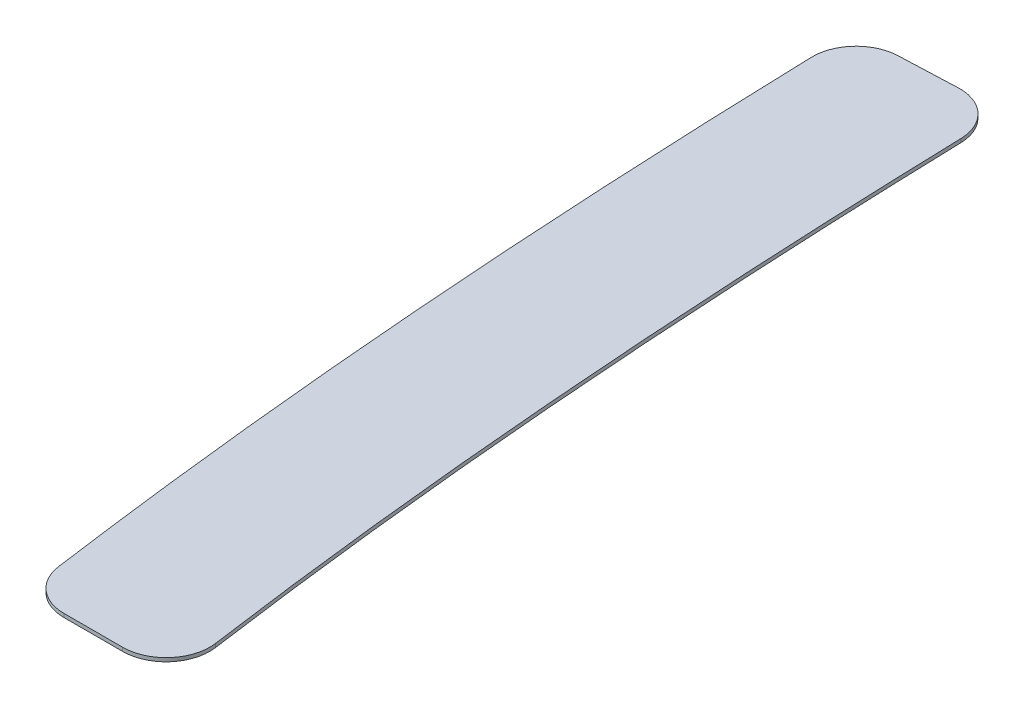
ISO-10303-21;
HEADER;
FILE_DESCRIPTION(('STEP AP214'),'2;1');
FILE_NAME('part.step','',(''),(''),'','','');
FILE_SCHEMA(('AUTOMOTIVE_DESIGN { 1 0 10303 214 1 1 1 1 }'));
ENDSEC;
DATA;
#1=APPLICATION_CONTEXT('core data for automotive mechanical design processes');
#2=APPLICATION_PROTOCOL_DEFINITION('international standard','automotive_design',2000,#1);
#3=PRODUCT_CONTEXT('',#1,'mechanical');
#4=PRODUCT('Part','Part','',(#3));
#5=PRODUCT_RELATED_PRODUCT_CATEGORY('part','',(#4));
#6=PRODUCT_DEFINITION_FORMATION('','',#4);
#7=PRODUCT_DEFINITION_CONTEXT('part definition',#1,'design');
#8=PRODUCT_DEFINITION('design','',#6,#7);
#9=PRODUCT_DEFINITION_SHAPE('','',#8);
#10=(LENGTH_UNIT() NAMED_UNIT(*) SI_UNIT(.MILLI.,.METRE.));
#11=(NAMED_UNIT(*) PLANE_ANGLE_UNIT() SI_UNIT($,.RADIAN.));
#12=(NAMED_UNIT(*) SI_UNIT($,.STERADIAN.) SOLID_ANGLE_UNIT());
#13=UNCERTAINTY_MEASURE_WITH_UNIT(LENGTH_MEASURE(1.E-05),#10,'distance_accuracy_value','');
#14=(GEOMETRIC_REPRESENTATION_CONTEXT(3) GLOBAL_UNCERTAINTY_ASSIGNED_CONTEXT((#13)) GLOBAL_UNIT_ASSIGNED_CONTEXT((#10,
#11,#12)) REPRESENTATION_CONTEXT('',''));
#15=CARTESIAN_POINT('',(0.,0.,0.));
#16=DIRECTION('',(0.,0.,1.));
#17=DIRECTION('',(1.,0.,0.));
#18=AXIS2_PLACEMENT_3D('',#15,#16,#17);
#19=CARTESIAN_POINT('',(791.023507922779,505.5,308.));
#20=DIRECTION('',(0.,1.,0.));
#21=DIRECTION('',(0.,0.,-1.));
#22=AXIS2_PLACEMENT_3D('',#19,#20,#21);
#23=CYLINDRICAL_SURFACE('',#22,12.);
#24=CARTESIAN_POINT('',(791.023507922779,505.,308.));
#25=DIRECTION('',(0.,-1.,0.));
#26=DIRECTION('',(0.,0.,-1.));
#27=AXIS2_PLACEMENT_3D('',#24,#25,#26);
#28=CIRCLE('',#27,12.);
#29=CARTESIAN_POINT('',(791.023507922779,505.,320.));
#30=VERTEX_POINT('',#29);
#31=CARTESIAN_POINT('',(779.13943328407,505.,309.663962133459));
#32=VERTEX_POINT('',#31);
#33=EDGE_CURVE('E114',#30,#32,#28,.T.);
#34=ORIENTED_EDGE('',*,*,#33,.F.);
#35=DIRECTION('',(0.,-1.,0.));
#36=VECTOR('',#35,1.);
#37=CARTESIAN_POINT('',(791.023507922779,505.,320.));
#38=LINE('',#37,#36);
#39=CARTESIAN_POINT('',(791.023507922779,506.,320.000000002894));
#40=VERTEX_POINT('',#39);
#41=EDGE_CURVE('E221',#40,#30,#38,.T.);
#42=ORIENTED_EDGE('',*,*,#41,.F.);
#43=CARTESIAN_POINT('',(791.023507922779,506.,308.));
#44=DIRECTION('',(0.,1.,0.));
#45=DIRECTION('',(0.,0.,-1.));
#46=AXIS2_PLACEMENT_3D('',#43,#44,#45);
#47=CIRCLE('',#46,12.);
#48=CARTESIAN_POINT('',(779.13943328407,506.,309.663962133459));
#49=VERTEX_POINT('',#48);
#50=EDGE_CURVE('E96',#49,#40,#47,.T.);
#51=ORIENTED_EDGE('',*,*,#50,.F.);
#52=DIRECTION('',(0.,1.,0.));
#53=VECTOR('',#52,1.);
#54=CARTESIAN_POINT('',(779.13943328407,506.,309.663962133459));
#55=LINE('',#54,#53);
#56=EDGE_CURVE('E125',#32,#49,#55,.T.);
#57=ORIENTED_EDGE('',*,*,#56,.F.);
#58=EDGE_LOOP('',(#34,#42,#51,#57));
#59=FACE_BOUND('',#58,.T.);
#60=ADVANCED_FACE('F17',(#59),#23,.T.);
#61=CARTESIAN_POINT('',(807.180361883752,505.5,308.));
#62=DIRECTION('',(0.,1.,0.));
#63=DIRECTION('',(0.,0.,-1.));
#64=AXIS2_PLACEMENT_3D('',#61,#62,#63);
#65=CYLINDRICAL_SURFACE('',#64,12.);
#66=CARTESIAN_POINT('',(807.180361883752,505.,308.));
#67=DIRECTION('',(0.,-1.,0.));
#68=DIRECTION('',(0.,0.,-1.));
#69=AXIS2_PLACEMENT_3D('',#66,#67,#68);
#70=CIRCLE('',#69,12.);
#71=CARTESIAN_POINT('',(819.061971704641,505.,306.318528006736));
#72=VERTEX_POINT('',#71);
#73=CARTESIAN_POINT('',(807.180361883752,505.,320.));
#74=VERTEX_POINT('',#73);
#75=EDGE_CURVE('E44',#72,#74,#70,.T.);
#76=ORIENTED_EDGE('',*,*,#75,.F.);
#77=DIRECTION('',(0.,-1.,0.));
#78=VECTOR('',#77,1.);
#79=CARTESIAN_POINT('',(819.061971704642,505.,306.318528006736));
#80=LINE('',#79,#78);
#81=CARTESIAN_POINT('',(819.06197170464,506.,306.318528006724));
#82=VERTEX_POINT('',#81);
#83=EDGE_CURVE('E194',#82,#72,#80,.T.);
#84=ORIENTED_EDGE('',*,*,#83,.F.);
#85=CARTESIAN_POINT('',(807.180361883752,506.,308.));
#86=DIRECTION('',(0.,1.,0.));
#87=DIRECTION('',(0.,0.,-1.));
#88=AXIS2_PLACEMENT_3D('',#85,#86,#87);
#89=CIRCLE('',#88,12.);
#90=CARTESIAN_POINT('',(807.180361883752,506.,320.000000002894));
#91=VERTEX_POINT('',#90);
#92=EDGE_CURVE('E87',#91,#82,#89,.T.);
#93=ORIENTED_EDGE('',*,*,#92,.F.);
#94=DIRECTION('',(0.,1.,0.));
#95=VECTOR('',#94,1.);
#96=CARTESIAN_POINT('',(807.180361883752,505.,320.));
#97=LINE('',#96,#95);
#98=EDGE_CURVE('E230',#74,#91,#97,.T.);
#99=ORIENTED_EDGE('',*,*,#98,.F.);
#100=EDGE_LOOP('',(#76,#84,#93,#99));
#101=FACE_BOUND('',#100,.T.);
#102=ADVANCED_FACE('F343',(#101),#65,.T.);
#103=CARTESIAN_POINT('',(773.296330371409,505.5,84.077167247855));
#104=DIRECTION('',(0.,1.,0.));
#105=DIRECTION('',(0.,0.,-1.));
#106=AXIS2_PLACEMENT_3D('',#103,#104,#105);
#107=CYLINDRICAL_SURFACE('',#106,12.);
#108=CARTESIAN_POINT('',(773.296330371409,505.,84.077167247855));
#109=DIRECTION('',(0.,-1.,0.));
#110=DIRECTION('',(0.,0.,-1.));
#111=AXIS2_PLACEMENT_3D('',#108,#109,#110);
#112=CIRCLE('',#111,12.);
#113=CARTESIAN_POINT('',(761.301287535022,505.,84.422054697985));
#114=VERTEX_POINT('',#113);
#115=CARTESIAN_POINT('',(772.817205012499,505.,72.0867361092158));
#116=VERTEX_POINT('',#115);
#117=EDGE_CURVE('E30',#114,#116,#112,.T.);
#118=ORIENTED_EDGE('',*,*,#117,.F.);
#119=DIRECTION('',(0.,-1.,0.));
#120=VECTOR('',#119,1.);
#121=CARTESIAN_POINT('',(761.301287535022,505.,84.422054697985));
#122=LINE('',#121,#120);
#123=CARTESIAN_POINT('',(761.301287535023,506.,84.4220546979857));
#124=VERTEX_POINT('',#123);
#125=EDGE_CURVE('E134',#124,#114,#122,.T.);
#126=ORIENTED_EDGE('',*,*,#125,.F.);
#127=CARTESIAN_POINT('',(773.296330371409,506.,84.077167247855));
#128=DIRECTION('',(0.,1.,0.));
#129=DIRECTION('',(0.,0.,-1.));
#130=AXIS2_PLACEMENT_3D('',#127,#128,#129);
#131=CIRCLE('',#130,12.);
#132=CARTESIAN_POINT('',(772.817205012499,506.,72.0867361092158));
#133=VERTEX_POINT('',#132);
#134=EDGE_CURVE('E235',#133,#124,#131,.T.);
#135=ORIENTED_EDGE('',*,*,#134,.F.);
#136=DIRECTION('',(0.,1.,0.));
#137=VECTOR('',#136,1.);
#138=CARTESIAN_POINT('',(772.817205012499,505.,72.0867361092158));
#139=LINE('',#138,#137);
#140=EDGE_CURVE('E166',#116,#133,#139,.T.);
#141=ORIENTED_EDGE('',*,*,#140,.F.);
#142=EDGE_LOOP('',(#118,#126,#135,#141));
#143=FACE_BOUND('',#142,.T.);
#144=ADVANCED_FACE('F334',(#143),#107,.T.);
#145=CARTESIAN_POINT('',(789.28405441753,505.5,83.4383141546534));
#146=DIRECTION('',(0.,1.,0.));
#147=DIRECTION('',(0.,0.,-1.));
#148=AXIS2_PLACEMENT_3D('',#145,#146,#147);
#149=CYLINDRICAL_SURFACE('',#148,12.);
#150=CARTESIAN_POINT('',(789.28405441753,505.,83.4383141546534));
#151=DIRECTION('',(0.,-1.,0.));
#152=DIRECTION('',(0.,0.,-1.));
#153=AXIS2_PLACEMENT_3D('',#150,#151,#152);
#154=CIRCLE('',#153,12.);
#155=CARTESIAN_POINT('',(788.80492905862,505.,71.4478830160136));
#156=VERTEX_POINT('',#155);
#157=CARTESIAN_POINT('',(801.279116111256,505.,83.0940831803331));
#158=VERTEX_POINT('',#157);
#159=EDGE_CURVE('E11',#156,#158,#154,.T.);
#160=ORIENTED_EDGE('',*,*,#159,.F.);
#161=DIRECTION('',(0.,-1.,0.));
#162=VECTOR('',#161,1.);
#163=CARTESIAN_POINT('',(788.80492905862,505.,71.4478830160136));
#164=LINE('',#163,#162);
#165=CARTESIAN_POINT('',(788.80492905862,506.,71.4478830160136));
#166=VERTEX_POINT('',#165);
#167=EDGE_CURVE('E179',#166,#156,#164,.T.);
#168=ORIENTED_EDGE('',*,*,#167,.F.);
#169=CARTESIAN_POINT('',(789.28405441753,506.,83.4383141546534));
#170=DIRECTION('',(0.,1.,0.));
#171=DIRECTION('',(0.,0.,-1.));
#172=AXIS2_PLACEMENT_3D('',#169,#170,#171);
#173=CIRCLE('',#172,12.);
#174=CARTESIAN_POINT('',(801.279116111256,506.,83.0940831803331));
#175=VERTEX_POINT('',#174);
#176=EDGE_CURVE('E250',#175,#166,#173,.T.);
#177=ORIENTED_EDGE('',*,*,#176,.F.);
#178=DIRECTION('',(0.,1.,0.));
#179=VECTOR('',#178,1.);
#180=CARTESIAN_POINT('',(801.279116111257,506.,83.0940831803331));
#181=LINE('',#180,#179);
#182=EDGE_CURVE('E207',#158,#175,#181,.T.);
#183=ORIENTED_EDGE('',*,*,#182,.F.);
#184=EDGE_LOOP('',(#160,#168,#177,#183));
#185=FACE_BOUND('',#184,.T.);
#186=ADVANCED_FACE('F326',(#185),#149,.T.);
#187=CARTESIAN_POINT('',(0.,505.,0.));
#188=DIRECTION('',(0.,1.,0.));
#189=DIRECTION('',(1.,0.,0.));
#190=AXIS2_PLACEMENT_3D('',#187,#188,#189);
#191=PLANE('',#190);
#192=CARTESIAN_POINT('',(825.006522365139,505.,344.676532488364));
#193=CARTESIAN_POINT('',(820.180034677245,505.,316.105799526349));
#194=CARTESIAN_POINT('',(815.273194099068,505.,280.231997901681));
#195=CARTESIAN_POINT('',(811.106266200122,505.,240.611100509871));
#196=CARTESIAN_POINT('',(809.718658077188,505.,226.178693766515));
#197=CARTESIAN_POINT('',(806.891459268486,505.,194.858973003472));
#198=CARTESIAN_POINT('',(804.168238169567,505.,155.199510505898));
#199=CARTESIAN_POINT('',(802.317524885658,505.,114.284098854535));
#200=CARTESIAN_POINT('',(801.473615525855,505.,90.2725977588578));
#201=CARTESIAN_POINT('',(801.133355185038,505.,78.1971238869387));
#202=CARTESIAN_POINT('',(800.958659812526,505.,70.9622323715767));
#203=B_SPLINE_CURVE_WITH_KNOTS('',3,(#192,#193,#194,#195,#196,#197,#198,#199,#200,#201,#202),
.UNSPECIFIED.,.F.,.F.,(4,1,1,1,1,1,1,1,4),(0.,0.316086158119462,0.394843191255499,
0.434611216199119,0.474254730428439,0.737897375698214,0.868215493286134,0.921051376030962,1.),.UNSPECIFIED.);
#204=EDGE_CURVE('E200',#72,#158,#203,.T.);
#205=ORIENTED_EDGE('',*,*,#204,.F.);
#206=ORIENTED_EDGE('',*,*,#75,.T.);
#207=DIRECTION('',(1.,0.,0.));
#208=VECTOR('',#207,1.);
#209=CARTESIAN_POINT('',(0.,505.,320.));
#210=LINE('',#209,#208);
#211=EDGE_CURVE('E119',#30,#74,#210,.T.);
#212=ORIENTED_EDGE('',*,*,#211,.F.);
#213=ORIENTED_EDGE('',*,*,#33,.T.);
#214=CARTESIAN_POINT('',(760.569499720048,505.,52.5601810505374));
#215=CARTESIAN_POINT('',(761.091505341413,505.,82.6829114913813));
#216=CARTESIAN_POINT('',(762.432290422846,505.,123.425369651162));
#217=CARTESIAN_POINT('',(765.217645154549,505.,170.811171866914));
#218=CARTESIAN_POINT('',(766.724623605165,505.,192.135662672798));
#219=CARTESIAN_POINT('',(770.306874271752,505.,237.764615563687));
#220=CARTESIAN_POINT('',(775.340366220356,505.,284.667949879056));
#221=CARTESIAN_POINT('',(781.990567226446,505.,329.322734262035));
#222=CARTESIAN_POINT('',(784.118831957731,505.,342.658805357965));
#223=CARTESIAN_POINT('',(785.00130578463,505.,348.002368260799));
#224=CARTESIAN_POINT('',(785.565207915593,505.,351.339849535134));
#225=B_SPLINE_CURVE_WITH_KNOTS('',3,(#214,#215,#216,#217,#218,#219,#220,#221,#222,#223,#224),
.UNSPECIFIED.,.F.,.F.,(4,1,1,1,1,1,1,1,4),(0.,0.301175313927396,0.407439214767169,
0.474505160891021,0.514874093629566,0.864991867765046,0.945862406011145,0.966162130211192,1.),.UNSPECIFIED.);
#226=EDGE_CURVE('E21',#114,#32,#225,.T.);
#227=ORIENTED_EDGE('',*,*,#226,.F.);
#228=ORIENTED_EDGE('',*,*,#117,.T.);
#229=DIRECTION('',(-0.999202594886604,0.,0.0399271132424845));
#230=VECTOR('',#229,1.);
#231=CARTESIAN_POINT('',(783.47073153151,505.,71.6610320908985));
#232=LINE('',#231,#230);
#233=EDGE_CURVE('E158',#156,#116,#232,.T.);
#234=ORIENTED_EDGE('',*,*,#233,.F.);
#235=ORIENTED_EDGE('',*,*,#159,.T.);
#236=EDGE_LOOP('',(#205,#206,#212,#213,#227,#228,#234,#235));
#237=FACE_BOUND('',#236,.T.);
#238=ADVANCED_FACE('F116',(#237),#191,.F.);
#239=CARTESIAN_POINT('',(0.,506.,0.));
#240=DIRECTION('',(0.,1.,0.));
#241=DIRECTION('',(1.,0.,0.));
#242=AXIS2_PLACEMENT_3D('',#239,#240,#241);
#243=PLANE('',#242);
#244=DIRECTION('',(-0.999202594886604,0.,0.0399271132424845));
#245=VECTOR('',#244,1.);
#246=CARTESIAN_POINT('',(783.47073153151,506.,71.6610320908985));
#247=LINE('',#246,#245);
#248=EDGE_CURVE('E173',#166,#133,#247,.T.);
#249=ORIENTED_EDGE('',*,*,#248,.T.);
#250=ORIENTED_EDGE('',*,*,#134,.T.);
#251=CARTESIAN_POINT('',(760.569499720048,506.,52.5601810505374));
#252=CARTESIAN_POINT('',(761.091505341413,506.,82.6829114913813));
#253=CARTESIAN_POINT('',(762.432290422846,506.,123.425369651162));
#254=CARTESIAN_POINT('',(765.217645154549,506.,170.811171866914));
#255=CARTESIAN_POINT('',(766.724623605165,506.,192.135662672798));
#256=CARTESIAN_POINT('',(770.306874271752,506.,237.764615563687));
#257=CARTESIAN_POINT('',(775.340366220356,506.,284.667949879056));
#258=CARTESIAN_POINT('',(781.990567226446,506.,329.322734262035));
#259=CARTESIAN_POINT('',(784.118831957731,506.,342.658805357965));
#260=CARTESIAN_POINT('',(785.00130578463,506.,348.002368260799));
#261=CARTESIAN_POINT('',(785.565207915593,506.,351.339849535134));
#262=B_SPLINE_CURVE_WITH_KNOTS('',3,(#251,#252,#253,#254,#255,#256,#257,#258,#259,#260,#261),
.UNSPECIFIED.,.F.,.F.,(4,1,1,1,1,1,1,1,4),(0.,0.301175313927396,0.407439214767169,
0.474505160891021,0.514874093629566,0.864991867765046,0.945862406011145,0.966162130211192,1.),.UNSPECIFIED.);
#263=EDGE_CURVE('E129',#124,#49,#262,.T.);
#264=ORIENTED_EDGE('',*,*,#263,.T.);
#265=ORIENTED_EDGE('',*,*,#50,.T.);
#266=DIRECTION('',(1.,0.,0.));
#267=VECTOR('',#266,1.);
#268=CARTESIAN_POINT('',(0.,506.,320.000000002894));
#269=LINE('',#268,#267);
#270=EDGE_CURVE('E214',#40,#91,#269,.T.);
#271=ORIENTED_EDGE('',*,*,#270,.T.);
#272=ORIENTED_EDGE('',*,*,#92,.T.);
#273=CARTESIAN_POINT('',(825.006522365139,506.,344.676532488364));
#274=CARTESIAN_POINT('',(820.180034677245,506.,316.105799526349));
#275=CARTESIAN_POINT('',(815.273194099068,506.,280.231997901681));
#276=CARTESIAN_POINT('',(811.106266200122,506.,240.611100509871));
#277=CARTESIAN_POINT('',(809.718658077188,506.,226.178693766515));
#278=CARTESIAN_POINT('',(806.891459268486,506.,194.858973003472));
#279=CARTESIAN_POINT('',(804.168238169567,506.,155.199510505898));
#280=CARTESIAN_POINT('',(802.317524885658,506.,114.284098854535));
#281=CARTESIAN_POINT('',(801.473615525855,506.,90.2725977588578));
#282=CARTESIAN_POINT('',(801.133355185038,506.,78.1971238869387));
#283=CARTESIAN_POINT('',(800.958659812526,506.,70.9622323715767));
#284=B_SPLINE_CURVE_WITH_KNOTS('',3,(#273,#274,#275,#276,#277,#278,#279,#280,#281,#282,#283),
.UNSPECIFIED.,.F.,.F.,(4,1,1,1,1,1,1,1,4),(0.,0.316086158119462,0.394843191255499,
0.434611216199119,0.474254730428439,0.737897375698214,0.868215493286134,0.921051376030962,1.),.UNSPECIFIED.);
#285=EDGE_CURVE('E186',#82,#175,#284,.T.);
#286=ORIENTED_EDGE('',*,*,#285,.T.);
#287=ORIENTED_EDGE('',*,*,#176,.T.);
#288=EDGE_LOOP('',(#249,#250,#264,#265,#271,#272,#286,#287));
#289=FACE_BOUND('',#288,.T.);
#290=ADVANCED_FACE('F19',(#289),#243,.T.);
#291=CARTESIAN_POINT('',(0.,505.,320.));
#292=DIRECTION('',(0.,0.,1.));
#293=DIRECTION('',(1.,0.,0.));
#294=AXIS2_PLACEMENT_3D('',#291,#292,#293);
#295=PLANE('',#294);
#296=ORIENTED_EDGE('',*,*,#270,.F.);
#297=ORIENTED_EDGE('',*,*,#41,.T.);
#298=ORIENTED_EDGE('',*,*,#211,.T.);
#299=ORIENTED_EDGE('',*,*,#98,.T.);
#300=EDGE_LOOP('',(#296,#297,#298,#299));
#301=FACE_BOUND('',#300,.T.);
#302=ADVANCED_FACE('F299',(#301),#295,.T.);
#303=CARTESIAN_POINT('',(825.006522365139,505.,344.676532488364));
#304=CARTESIAN_POINT('',(820.180034677245,505.,316.105799526349));
#305=CARTESIAN_POINT('',(815.273194099068,505.,280.231997901681));
#306=CARTESIAN_POINT('',(811.106266200122,505.,240.611100509871));
#307=CARTESIAN_POINT('',(809.718658077188,505.,226.178693766515));
#308=CARTESIAN_POINT('',(806.891459268486,505.,194.858973003472));
#309=CARTESIAN_POINT('',(804.168238169567,505.,155.199510505898));
#310=CARTESIAN_POINT('',(802.317524885658,505.,114.284098854535));
#311=CARTESIAN_POINT('',(801.473615525855,505.,90.2725977588578));
#312=CARTESIAN_POINT('',(801.133355185038,505.,78.1971238869387));
#313=CARTESIAN_POINT('',(800.958659812526,505.,70.9622323715767));
#314=(BOUNDED_CURVE() B_SPLINE_CURVE(3,(#303,#304,#305,#306,#307,#308,#309,#310,#311,#312,#313),
.UNSPECIFIED.,.F.,.F.) B_SPLINE_CURVE_WITH_KNOTS((4,1,1,1,1,1,1,1,4),(0.,0.316086158119462,
0.394843191255499,0.434611216199119,0.474254730428439,0.737897375698214,0.868215493286134,
0.921051376030962,1.),
.UNSPECIFIED.) CURVE() GEOMETRIC_REPRESENTATION_ITEM() RATIONAL_B_SPLINE_CURVE((1.,1.,1.,1.,1.,
1.,1.,1.,1.,1.,1.)) REPRESENTATION_ITEM(''));
#315=DIRECTION('',(0.,1.,0.));
#316=VECTOR('',#315,1.);
#317=SURFACE_OF_LINEAR_EXTRUSION('',#314,#316);
#318=ORIENTED_EDGE('',*,*,#285,.F.);
#319=ORIENTED_EDGE('',*,*,#83,.T.);
#320=ORIENTED_EDGE('',*,*,#204,.T.);
#321=ORIENTED_EDGE('',*,*,#182,.T.);
#322=EDGE_LOOP('',(#318,#319,#320,#321));
#323=FACE_BOUND('',#322,.T.);
#324=ADVANCED_FACE('F288',(#323),#317,.T.);
#325=CARTESIAN_POINT('',(783.47073153151,505.,71.6610320908985));
#326=DIRECTION('',(-0.0399271132424845,0.,-0.999202594886604));
#327=DIRECTION('',(-0.999202594886604,0.,0.0399271132424845));
#328=AXIS2_PLACEMENT_3D('',#325,#326,#327);
#329=PLANE('',#328);
#330=ORIENTED_EDGE('',*,*,#233,.T.);
#331=ORIENTED_EDGE('',*,*,#140,.T.);
#332=ORIENTED_EDGE('',*,*,#248,.F.);
#333=ORIENTED_EDGE('',*,*,#167,.T.);
#334=EDGE_LOOP('',(#330,#331,#332,#333));
#335=FACE_BOUND('',#334,.T.);
#336=ADVANCED_FACE('F277',(#335),#329,.T.);
#337=CARTESIAN_POINT('',(785.565207915593,505.,351.339849535134));
#338=CARTESIAN_POINT('',(785.00130578463,505.,348.002368260799));
#339=CARTESIAN_POINT('',(784.118831957731,505.,342.658805357965));
#340=CARTESIAN_POINT('',(781.990567226446,505.,329.322734262035));
#341=CARTESIAN_POINT('',(775.340366220356,505.,284.667949879056));
#342=CARTESIAN_POINT('',(770.306874271752,505.,237.764615563687));
#343=CARTESIAN_POINT('',(766.724623605165,505.,192.135662672798));
#344=CARTESIAN_POINT('',(765.217645154549,505.,170.811171866914));
#345=CARTESIAN_POINT('',(762.432290422846,505.,123.425369651162));
#346=CARTESIAN_POINT('',(761.091505341413,505.,82.6829114913813));
#347=CARTESIAN_POINT('',(760.569499720048,505.,52.5601810505374));
#348=(BOUNDED_CURVE() B_SPLINE_CURVE(3,(#337,#338,#339,#340,#341,#342,#343,#344,#345,#346,#347),
.UNSPECIFIED.,.F.,.F.) B_SPLINE_CURVE_WITH_KNOTS((4,1,1,1,1,1,1,1,4),(0.,0.0338378697888083,
0.0541375939888553,0.135008132234954,0.485125906370434,0.525494839108979,0.592560785232831,
0.698824686072604,1.),
.UNSPECIFIED.) CURVE() GEOMETRIC_REPRESENTATION_ITEM() RATIONAL_B_SPLINE_CURVE((1.,1.,1.,1.,1.,
1.,1.,1.,1.,1.,1.)) REPRESENTATION_ITEM(''));
#349=DIRECTION('',(0.,1.,0.));
#350=VECTOR('',#349,1.);
#351=SURFACE_OF_LINEAR_EXTRUSION('',#348,#350);
#352=ORIENTED_EDGE('',*,*,#226,.T.);
#353=ORIENTED_EDGE('',*,*,#56,.T.);
#354=ORIENTED_EDGE('',*,*,#263,.F.);
#355=ORIENTED_EDGE('',*,*,#125,.T.);
#356=EDGE_LOOP('',(#352,#353,#354,#355));
#357=FACE_BOUND('',#356,.T.);
#358=ADVANCED_FACE('F132',(#357),#351,.F.);
#359=CLOSED_SHELL('',(#60,#102,#144,#186,#238,#290,#302,#324,#336,#358));
#360=MANIFOLD_SOLID_BREP('B1',#359);
#361=ADVANCED_BREP_SHAPE_REPRESENTATION('',(#18,#360),#14);
#362=SHAPE_DEFINITION_REPRESENTATION(#9,#361);
ENDSEC;
END-ISO-10303-21;
